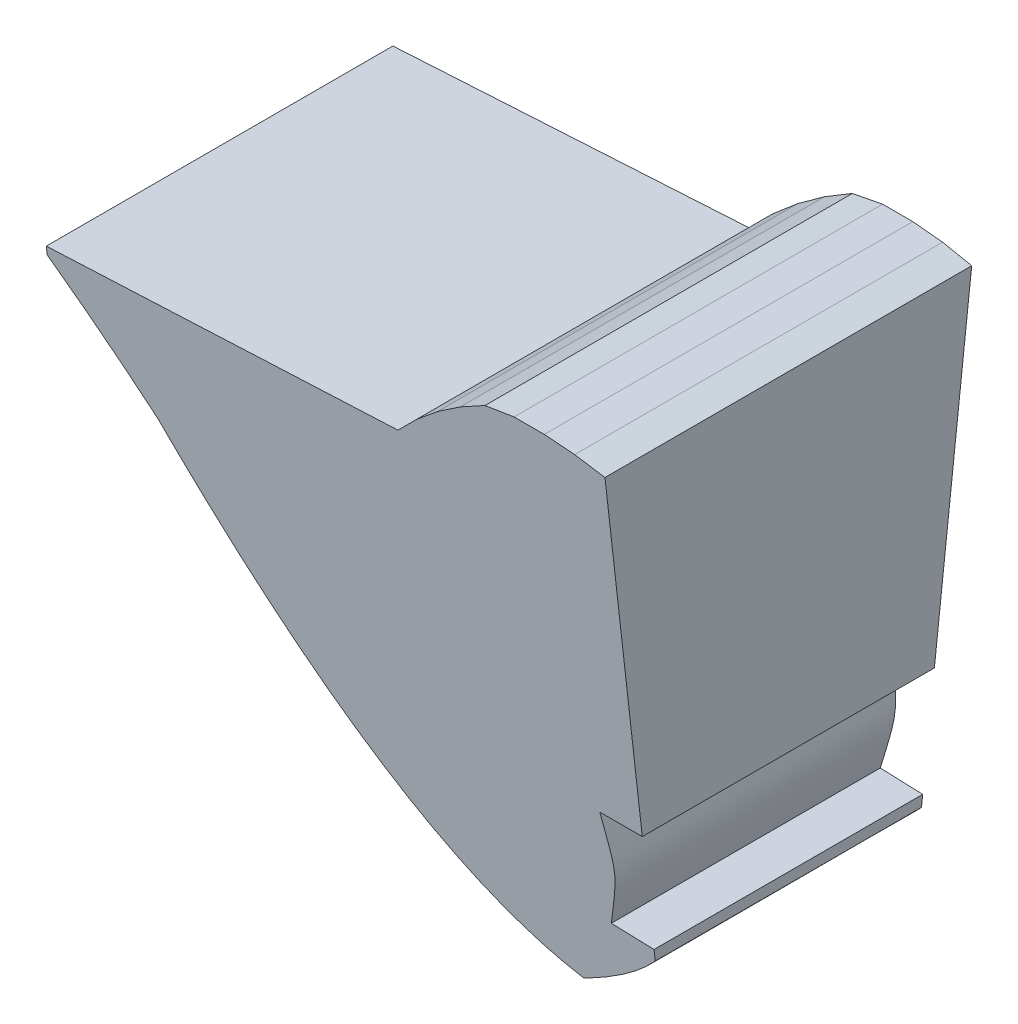
ISO-10303-21;
HEADER;
FILE_DESCRIPTION(('STEP AP214'),'2;1');
FILE_NAME('part.step','',(''),(''),'','','');
FILE_SCHEMA(('AUTOMOTIVE_DESIGN { 1 0 10303 214 1 1 1 1 }'));
ENDSEC;
DATA;
#1=APPLICATION_CONTEXT('core data for automotive mechanical design processes');
#2=APPLICATION_PROTOCOL_DEFINITION('international standard','automotive_design',2000,#1);
#3=PRODUCT_CONTEXT('',#1,'mechanical');
#4=PRODUCT('Part','Part','',(#3));
#5=PRODUCT_RELATED_PRODUCT_CATEGORY('part','',(#4));
#6=PRODUCT_DEFINITION_FORMATION('','',#4);
#7=PRODUCT_DEFINITION_CONTEXT('part definition',#1,'design');
#8=PRODUCT_DEFINITION('design','',#6,#7);
#9=PRODUCT_DEFINITION_SHAPE('','',#8);
#10=(LENGTH_UNIT() NAMED_UNIT(*) SI_UNIT(.MILLI.,.METRE.));
#11=(NAMED_UNIT(*) PLANE_ANGLE_UNIT() SI_UNIT($,.RADIAN.));
#12=(NAMED_UNIT(*) SI_UNIT($,.STERADIAN.) SOLID_ANGLE_UNIT());
#13=UNCERTAINTY_MEASURE_WITH_UNIT(LENGTH_MEASURE(1.E-05),#10,'distance_accuracy_value','');
#14=(GEOMETRIC_REPRESENTATION_CONTEXT(3) GLOBAL_UNCERTAINTY_ASSIGNED_CONTEXT((#13)) GLOBAL_UNIT_ASSIGNED_CONTEXT((#10,
#11,#12)) REPRESENTATION_CONTEXT('',''));
#15=CARTESIAN_POINT('',(0.,0.,0.));
#16=DIRECTION('',(0.,0.,1.));
#17=DIRECTION('',(1.,0.,0.));
#18=AXIS2_PLACEMENT_3D('',#15,#16,#17);
#19=CARTESIAN_POINT('',(0.355125000055651,-1.23774703808888E-13,7.21));
#20=DIRECTION('',(-1.,3.48538412642003E-13,0.));
#21=DIRECTION('',(-3.48538412642003E-13,-1.,0.));
#22=AXIS2_PLACEMENT_3D('',#19,#20,#21);
#23=PLANE('',#22);
#24=DIRECTION('',(0.,-0.993653373689782,0.112485434412263));
#25=VECTOR('',#24,1.);
#26=CARTESIAN_POINT('',(0.355125000056697,12.6081551722012,-7.21));
#27=LINE('',#26,#25);
#28=CARTESIAN_POINT('',(0.355125000056697,15.5338014071494,-7.54119455575611));
#29=VERTEX_POINT('',#28);
#30=CARTESIAN_POINT('',(0.355125000056447,1.97626956518499,-6.00642911422341));
#31=VERTEX_POINT('',#30);
#32=EDGE_CURVE('E58',#29,#31,#27,.T.);
#33=ORIENTED_EDGE('',*,*,#32,.F.);
#34=DIRECTION('',(0.,0.,-1.));
#35=VECTOR('',#34,1.);
#36=CARTESIAN_POINT('',(0.355125000056697,15.5338014071494,23.2398174057259));
#37=LINE('',#36,#35);
#38=CARTESIAN_POINT('',(0.355125000056697,15.5338014071494,7.54119455575611));
#39=VERTEX_POINT('',#38);
#40=EDGE_CURVE('E192',#39,#29,#37,.T.);
#41=ORIENTED_EDGE('',*,*,#40,.F.);
#42=DIRECTION('',(0.,0.993653373689782,0.112485434412263));
#43=VECTOR('',#42,1.);
#44=CARTESIAN_POINT('',(0.355125000056697,12.6081551722012,7.21));
#45=LINE('',#44,#43);
#46=CARTESIAN_POINT('',(0.355125000056697,1.97626956518499,6.00642911422342));
#47=VERTEX_POINT('',#46);
#48=EDGE_CURVE('E244',#47,#39,#45,.T.);
#49=ORIENTED_EDGE('',*,*,#48,.F.);
#50=DIRECTION('',(0.,0.,-1.));
#51=VECTOR('',#50,1.);
#52=CARTESIAN_POINT('',(0.355125000056447,1.97626956518499,7.21));
#53=LINE('',#52,#51);
#54=EDGE_CURVE('E316',#47,#31,#53,.T.);
#55=ORIENTED_EDGE('',*,*,#54,.T.);
#56=EDGE_LOOP('',(#33,#41,#49,#55));
#57=FACE_BOUND('',#56,.T.);
#58=ADVANCED_FACE('F43',(#57),#23,.F.);
#59=CARTESIAN_POINT('',(-23.0359211456035,0.,7.21));
#60=DIRECTION('',(-1.,0.,0.));
#61=DIRECTION('',(0.,0.,1.));
#62=AXIS2_PLACEMENT_3D('',#59,#60,#61);
#63=PLANE('',#62);
#64=DIRECTION('',(0.,0.,-1.));
#65=VECTOR('',#64,1.);
#66=CARTESIAN_POINT('',(-23.0359211456035,11.8716122879342,7.21));
#67=LINE('',#66,#65);
#68=CARTESIAN_POINT('',(-23.0359211456035,11.8716122879342,7.12662047501294));
#69=VERTEX_POINT('',#68);
#70=CARTESIAN_POINT('',(-23.0359211456035,11.8716122879342,-7.12662047501294));
#71=VERTEX_POINT('',#70);
#72=EDGE_CURVE('E325',#69,#71,#67,.T.);
#73=ORIENTED_EDGE('',*,*,#72,.T.);
#74=DIRECTION('',(0.,-0.993653373689782,0.112485434412263));
#75=VECTOR('',#74,1.);
#76=CARTESIAN_POINT('',(-23.0359211456035,12.6081551722012,-7.21));
#77=LINE('',#76,#75);
#78=CARTESIAN_POINT('',(-23.0359211456035,11.5401378200982,-7.08909627341673));
#79=VERTEX_POINT('',#78);
#80=EDGE_CURVE('E239',#71,#79,#77,.T.);
#81=ORIENTED_EDGE('',*,*,#80,.T.);
#82=DIRECTION('',(0.,0.,-1.));
#83=VECTOR('',#82,1.);
#84=CARTESIAN_POINT('',(-23.0359211456035,11.5401378200983,7.21));
#85=LINE('',#84,#83);
#86=CARTESIAN_POINT('',(-23.0359211456035,11.5401378200982,7.08909627341673));
#87=VERTEX_POINT('',#86);
#88=EDGE_CURVE('E319',#87,#79,#85,.T.);
#89=ORIENTED_EDGE('',*,*,#88,.F.);
#90=DIRECTION('',(0.,0.993653373689782,0.112485434412263));
#91=VECTOR('',#90,1.);
#92=CARTESIAN_POINT('',(-23.0359211456035,12.6081551722012,7.21));
#93=LINE('',#92,#91);
#94=EDGE_CURVE('E221',#87,#69,#93,.T.);
#95=ORIENTED_EDGE('',*,*,#94,.T.);
#96=EDGE_LOOP('',(#73,#81,#89,#95));
#97=FACE_BOUND('',#96,.T.);
#98=ADVANCED_FACE('F410',(#97),#63,.T.);
#99=CARTESIAN_POINT('',(-18.9451921135982,7.54091889574655,7.21));
#100=CARTESIAN_POINT('',(-10.2150083842792,-3.69764410322756,7.21));
#101=CARTESIAN_POINT('',(-2.84660482498738,-5.05908110388432,7.21));
#102=(BOUNDED_CURVE() B_SPLINE_CURVE(2,(#99,#100,#101),.UNSPECIFIED.,.F.,
.F.) B_SPLINE_CURVE_WITH_KNOTS((3,3),(0.497667241108509,0.499554279588011),
.UNSPECIFIED.) CURVE() GEOMETRIC_REPRESENTATION_ITEM() RATIONAL_B_SPLINE_CURVE((1.,1.,1.)) REPRESENTATION_ITEM(''));
#103=DIRECTION('',(0.,0.,-1.));
#104=VECTOR('',#103,1.);
#105=SURFACE_OF_LINEAR_EXTRUSION('',#102,#104);
#106=DIRECTION('',(0.,0.,-1.));
#107=VECTOR('',#106,1.);
#108=CARTESIAN_POINT('',(-18.9451921135982,7.54091889574657,7.21));
#109=LINE('',#108,#107);
#110=CARTESIAN_POINT('',(-18.9451921135982,7.54091889574657,6.63636910524442));
#111=VERTEX_POINT('',#110);
#112=CARTESIAN_POINT('',(-18.9451921135982,7.54091889574657,-6.63636910524442));
#113=VERTEX_POINT('',#112);
#114=EDGE_CURVE('E315',#111,#113,#109,.T.);
#115=ORIENTED_EDGE('',*,*,#114,.T.);
#116=CARTESIAN_POINT('',(-18.9451921135982,7.54091889574655,-6.63636910524441));
#117=CARTESIAN_POINT('',(-18.7033608655423,7.22962108931645,-6.60112898035273));
#118=CARTESIAN_POINT('',(-18.4592647140916,6.9200497206851,-6.56608429494821));
#119=CARTESIAN_POINT('',(-17.9661198805234,6.30464603742845,-6.49641819962467));
#120=CARTESIAN_POINT('',(-17.7170694462669,5.99881510969872,-6.46179694670763));
#121=CARTESIAN_POINT('',(-17.2137366178937,5.3913665824337,-6.39303140604553));
#122=CARTESIAN_POINT('',(-16.9594535947769,5.08974949683998,-6.35888717648066));
#123=CARTESIAN_POINT('',(-16.4451285665965,4.49103725761873,-6.29111061767257));
#124=CARTESIAN_POINT('',(-16.1850826962375,4.19394537928884,-6.25747865920581));
#125=CARTESIAN_POINT('',(-15.6590118901181,3.60508061675355,-6.1908168731366));
#126=CARTESIAN_POINT('',(-15.3929875534481,3.31330720485499,-6.15778698579723));
#127=CARTESIAN_POINT('',(-14.8544901847056,2.7357195544677,-6.09240181277284));
#128=CARTESIAN_POINT('',(-14.5820174931064,2.44990500284308,-6.06004649163962));
#129=CARTESIAN_POINT('',(-13.9777704357619,1.83142011947111,-5.99003159245484));
#130=CARTESIAN_POINT('',(-13.6445482479649,1.50014167377654,-5.95252958132897));
#131=CARTESIAN_POINT('',(-12.9673134934436,0.848664446736888,-5.87877982026175));
#132=CARTESIAN_POINT('',(-12.623301443116,0.528465136688492,-5.84253201046914));
#133=CARTESIAN_POINT('',(-11.9227759490938,-0.0995013958587514,-5.7714437516454));
#134=CARTESIAN_POINT('',(-11.5662405708663,-0.407244542107335,-5.73660602813964));
#135=CARTESIAN_POINT('',(-10.840142749037,-1.00720368374379,-5.66868831511867));
#136=CARTESIAN_POINT('',(-10.4705807273197,-1.29942018121482,-5.6356082687657));
#137=CARTESIAN_POINT('',(-9.71382699072171,-1.86779135556405,-5.57126643674768));
#138=CARTESIAN_POINT('',(-9.32650636654571,-2.14377746328672,-5.540023733768));
#139=CARTESIAN_POINT('',(-8.5360986768139,-2.67282289543975,-5.48013372902864));
#140=CARTESIAN_POINT('',(-8.13300835344273,-2.92587744631612,-5.45148696765387));
#141=CARTESIAN_POINT('',(-7.31201826568453,-3.40280761684766,-5.39749661363601));
#142=CARTESIAN_POINT('',(-6.89419365451789,-3.62680992502778,-5.37213867935817));
#143=CARTESIAN_POINT('',(-6.04187322097519,-4.0405536088069,-5.32530128189388));
#144=CARTESIAN_POINT('',(-5.60738935372736,-4.23031901573022,-5.30381909826786));
#145=CARTESIAN_POINT('',(-4.78985442909107,-4.54236533838515,-5.26849423842238));
#146=CARTESIAN_POINT('',(-4.4091055725695,-4.67052923075731,-5.25398558631979));
#147=CARTESIAN_POINT('',(-3.82960691198316,-4.83674345690554,-5.23516948814227));
#148=CARTESIAN_POINT('',(-3.63462104960687,-4.8878904691115,-5.22937944702812));
#149=CARTESIAN_POINT('',(-3.24229120544362,-4.9807402777546,-5.21886848683127));
#150=CARTESIAN_POINT('',(-3.0449461414238,-5.02243854990591,-5.21414807991536));
#151=CARTESIAN_POINT('',(-2.84660482498738,-5.05908110388432,-5.21));
#152=B_SPLINE_CURVE_WITH_KNOTS('',3,(#116,#117,#118,#119,#120,#121,#122,#123,#124,#125,#126,
#127,#128,#129,#130,#131,#132,#133,#134,#135,#136,#137,#138,#139,#140,#141,#142,#143,#144,#145,
#146,#147,#148,#149,#150,#151),.UNSPECIFIED.,.F.,.F.,(4,2,2,2,2,2,2,2,2,2,2,2,2,2,2,2,2,4),(0.,
1.1872997216569,2.37502708567824,3.56289806807204,4.75159146291787,5.9401662676152,
7.12867845491363,8.54255640265696,9.95636678593971,11.3727907462706,12.7891688759803,
14.2183172044781,15.6477623519031,17.0707480146133,18.4927309460623,19.6971402338765,
20.3019233237111,20.9069953892921),.UNSPECIFIED.);
#153=CARTESIAN_POINT('',(-2.84660482498738,-5.05908110388432,-5.21));
#154=VERTEX_POINT('',#153);
#155=EDGE_CURVE('E356',#113,#154,#152,.T.);
#156=ORIENTED_EDGE('',*,*,#155,.T.);
#157=DIRECTION('',(0.,0.,-1.));
#158=VECTOR('',#157,1.);
#159=CARTESIAN_POINT('',(-2.84660482498738,-5.05908110388432,7.21));
#160=LINE('',#159,#158);
#161=CARTESIAN_POINT('',(-2.84660482498738,-5.05908110388432,5.21));
#162=VERTEX_POINT('',#161);
#163=EDGE_CURVE('E340',#162,#154,#160,.T.);
#164=ORIENTED_EDGE('',*,*,#163,.F.);
#165=CARTESIAN_POINT('',(-2.84660482498738,-5.05908110388432,5.21));
#166=CARTESIAN_POINT('',(-3.0836355452615,-5.01529762547054,5.21495646039138));
#167=CARTESIAN_POINT('',(-3.31925014057108,-4.96428184629726,5.22073164541478));
#168=CARTESIAN_POINT('',(-3.78628189704186,-4.84911384389608,5.23376911212451));
#169=CARTESIAN_POINT('',(-4.01771143135529,-4.78501130060695,5.24102576984815));
#170=CARTESIAN_POINT('',(-4.47638324853452,-4.64477679089168,5.25690086287615));
#171=CARTESIAN_POINT('',(-4.70363211310206,-4.56866593727755,5.26551690812791));
#172=CARTESIAN_POINT('',(-5.1539801611568,-4.40545252874729,5.28399330205617));
#173=CARTESIAN_POINT('',(-5.37708095327682,-4.31835434125152,5.29385315632366));
#174=CARTESIAN_POINT('',(-5.81545834234536,-4.13567110279715,5.31453361087802));
#175=CARTESIAN_POINT('',(-6.03080317783365,-4.04024711994086,5.32533597762798));
#176=CARTESIAN_POINT('',(-6.45748946905634,-3.84057736608456,5.34793937192645));
#177=CARTESIAN_POINT('',(-6.66882789943329,-3.73632522989765,5.35974112003892));
#178=CARTESIAN_POINT('',(-7.08747417766979,-3.51983158147829,5.38424904476877));
#179=CARTESIAN_POINT('',(-7.29477947597257,-3.40758521204135,5.39695577124062));
#180=CARTESIAN_POINT('',(-7.70530843131035,-3.17590609220346,5.42318275051655));
#181=CARTESIAN_POINT('',(-7.90853147430462,-3.0564722713248,5.43670312450288));
#182=CARTESIAN_POINT('',(-8.45410340689061,-2.72385368196738,5.47435684511425));
#183=CARTESIAN_POINT('',(-8.79259906035209,-2.50440768840731,5.49919898682003));
#184=CARTESIAN_POINT('',(-9.45845448583479,-2.04949644973372,5.5506967119384));
#185=CARTESIAN_POINT('',(-9.78581359629267,-1.81403025542841,5.5773524028032));
#186=CARTESIAN_POINT('',(-10.4302582396863,-1.32938575303013,5.63221604925302));
#187=CARTESIAN_POINT('',(-10.7473396395034,-1.08020203459831,5.66042461730948));
#188=CARTESIAN_POINT('',(-11.3718438106499,-0.570176876647104,5.71816145288252));
#189=CARTESIAN_POINT('',(-11.6792662750814,-0.309335067346119,5.74768976225981));
#190=CARTESIAN_POINT('',(-12.2887351366992,0.225514030316342,5.80823676455314));
#191=CARTESIAN_POINT('',(-12.5906756597182,0.499640146613562,5.83926890925461));
#192=CARTESIAN_POINT('',(-13.1859914625247,1.05668157973797,5.90232817041119));
#193=CARTESIAN_POINT('',(-13.4793699933214,1.33959347409339,5.93435489942917));
#194=CARTESIAN_POINT('',(-14.0582984741035,1.91313890151101,5.99928247705986));
#195=CARTESIAN_POINT('',(-14.3438493181123,2.20377154523463,6.03218322499598));
#196=CARTESIAN_POINT('',(-14.9077244427009,2.7918210558895,6.09875272137508));
#197=CARTESIAN_POINT('',(-15.1860493084316,3.08923736980037,6.13242140721399));
#198=CARTESIAN_POINT('',(-15.7683607406539,3.72540309630891,6.20443784674841));
#199=CARTESIAN_POINT('',(-16.0715178451228,4.06490144250158,6.24287038264565));
#200=CARTESIAN_POINT('',(-16.6701836985208,4.7504922746204,6.32048193675692));
#201=CARTESIAN_POINT('',(-16.9656923307507,5.09658486102068,6.35966096634501));
#202=CARTESIAN_POINT('',(-17.4495199616275,5.67490501691598,6.42512906184765));
#203=CARTESIAN_POINT('',(-17.6398456690967,5.90547984199544,6.45123103065322));
#204=CARTESIAN_POINT('',(-18.0176052393411,6.36895711711416,6.50369846448112));
#205=CARTESIAN_POINT('',(-18.205039097963,6.60185957049552,6.5300639298818));
#206=CARTESIAN_POINT('',(-18.5771476687389,7.06981539005112,6.58303835239394));
#207=CARTESIAN_POINT('',(-18.7618224957771,7.30486866600559,6.60964729929217));
#208=CARTESIAN_POINT('',(-18.9451921135982,7.54091889574655,6.63636910524441));
#209=B_SPLINE_CURVE_WITH_KNOTS('',3,(#165,#166,#167,#168,#169,#170,#171,#172,#173,#174,#175,
#176,#177,#178,#179,#180,#181,#182,#183,#184,#185,#186,#187,#188,#189,#190,#191,#192,#193,#194,
#195,#196,#197,#198,#199,#200,#201,#202,#203,#204,#205,#206,#207,#208),.UNSPECIFIED.,.F.,.F.,(4,
2,2,2,2,2,2,2,2,2,2,2,2,2,2,2,2,2,2,2,2,4),(0.,0.723070627629283,1.44344574109941,
2.16256813451498,2.88140557514503,3.58855192345824,4.2962125448096,5.0043068623572,
5.71250690363926,6.92441762508089,8.13640021448464,9.3488642962315,10.5613668633146,
11.788141520998,13.0144441434254,14.2406061176645,15.4666684871313,16.8368576095009,
18.2070676256843,19.1073954524656,20.0077245721621,20.9080160976373),.UNSPECIFIED.);
#210=EDGE_CURVE('E274',#162,#111,#209,.T.);
#211=ORIENTED_EDGE('',*,*,#210,.T.);
#212=EDGE_LOOP('',(#115,#156,#164,#211));
#213=FACE_BOUND('',#212,.T.);
#214=ADVANCED_FACE('F44',(#213),#105,.F.);
#215=CARTESIAN_POINT('',(-2.84660482498738,-5.05908110388432,7.21));
#216=CARTESIAN_POINT('',(-0.742366881974002,-3.93520659958673,7.21));
#217=CARTESIAN_POINT('',(0.355124999965198,-2.72325322699678,7.21));
#218=(BOUNDED_CURVE() B_SPLINE_CURVE(2,(#215,#216,#217),.UNSPECIFIED.,.F.,
.F.) B_SPLINE_CURVE_WITH_KNOTS((3,3),(0.498812074629495,0.499412845463797),
.UNSPECIFIED.) CURVE() GEOMETRIC_REPRESENTATION_ITEM() RATIONAL_B_SPLINE_CURVE((1.,1.,1.)) REPRESENTATION_ITEM(''));
#219=DIRECTION('',(0.,0.,-1.));
#220=VECTOR('',#219,1.);
#221=SURFACE_OF_LINEAR_EXTRUSION('',#218,#220);
#222=ORIENTED_EDGE('',*,*,#163,.T.);
#223=CARTESIAN_POINT('',(-2.84660482498738,-5.05908110388432,-5.21));
#224=CARTESIAN_POINT('',(-2.67154367534484,-4.96554243060771,-5.22058894235803));
#225=CARTESIAN_POINT('',(-2.49778385523126,-4.86952307483158,-5.23145870764283));
#226=CARTESIAN_POINT('',(-2.15332890723938,-4.67164155861341,-5.25385966647147));
#227=CARTESIAN_POINT('',(-1.9826387176766,-4.56977092703724,-5.26539181898071));
#228=CARTESIAN_POINT('',(-1.64527137465746,-4.35955519460265,-5.2891890591545));
#229=CARTESIAN_POINT('',(-1.47859514121983,-4.25120862887406,-5.30145431264808));
#230=CARTESIAN_POINT('',(-1.15044448784201,-4.02724001195876,-5.32680843294344));
#231=CARTESIAN_POINT('',(-0.98896568487432,-3.911624347545,-5.33989657673763));
#232=CARTESIAN_POINT('',(-0.724614348138144,-3.7114805449727,-5.36255363519824));
#233=CARTESIAN_POINT('',(-0.619967455079453,-3.6292658395869,-5.37186066025876));
#234=CARTESIAN_POINT('',(-0.414118763296717,-3.46070156785231,-5.39094279275538));
#235=CARTESIAN_POINT('',(-0.312916415666604,-3.3743526656372,-5.40071782500895));
#236=CARTESIAN_POINT('',(-0.114288127047668,-3.19685300163986,-5.42081147873311));
#237=CARTESIAN_POINT('',(-0.0168745915935634,-3.10568844995875,-5.431131661274));
#238=CARTESIAN_POINT('',(0.173044677325633,-2.91833195578561,-5.45234114658855));
#239=CARTESIAN_POINT('',(0.265547074526193,-2.82213668167119,-5.46323082651485));
#240=CARTESIAN_POINT('',(0.355124999965198,-2.72325322699678,-5.47442481895704));
#241=B_SPLINE_CURVE_WITH_KNOTS('',3,(#223,#224,#225,#226,#227,#228,#229,#230,#231,#232,#233,
#234,#235,#236,#237,#238,#239,#240),.UNSPECIFIED.,.F.,.F.,(4,2,2,2,2,2,2,2,4),(0.,
0.596333361221147,1.19355295493407,1.79090815604603,2.38774565156578,2.78786762990545,
3.18792554534165,3.58919872466333,3.99074110013676),.UNSPECIFIED.);
#242=CARTESIAN_POINT('',(0.355125000010947,-2.72325322699678,-5.47442481895703));
#243=VERTEX_POINT('',#242);
#244=EDGE_CURVE('E362',#154,#243,#241,.T.);
#245=ORIENTED_EDGE('',*,*,#244,.T.);
#246=DIRECTION('',(0.,0.,-1.));
#247=VECTOR('',#246,1.);
#248=CARTESIAN_POINT('',(0.355124999965198,-2.72325322699678,7.21));
#249=LINE('',#248,#247);
#250=CARTESIAN_POINT('',(0.355125000010947,-2.72325322699678,5.47442481895703));
#251=VERTEX_POINT('',#250);
#252=EDGE_CURVE('E331',#251,#243,#249,.T.);
#253=ORIENTED_EDGE('',*,*,#252,.F.);
#254=CARTESIAN_POINT('',(0.355124999965198,-2.72325322699678,5.47442481895703));
#255=CARTESIAN_POINT('',(0.288265800066398,-2.79707578870119,5.46606781726749));
#256=CARTESIAN_POINT('',(0.219762299322532,-2.86939557158838,5.45788093599675));
#257=CARTESIAN_POINT('',(0.0798741499126208,-3.0111837154317,5.44182996553056));
#258=CARTESIAN_POINT('',(0.00849051694650479,-3.08065306448068,5.43396576447915));
#259=CARTESIAN_POINT('',(-0.209110404202349,-3.28478130911614,5.41085765164865));
#260=CARTESIAN_POINT('',(-0.359086186155244,-3.41549544786354,5.39606030171743));
#261=CARTESIAN_POINT('',(-0.666431647279958,-3.66745151891472,5.36753789253992));
#262=CARTESIAN_POINT('',(-0.823790135326829,-3.78870709059741,5.35381128926277));
#263=CARTESIAN_POINT('',(-1.14463764434189,-4.02329424679429,5.32725510893767));
#264=CARTESIAN_POINT('',(-1.30813354467851,-4.13661650521983,5.31442658763929));
#265=CARTESIAN_POINT('',(-1.58497175174893,-4.31986712055689,5.29368190381061));
#266=CARTESIAN_POINT('',(-1.69701528140079,-4.39175032218513,5.28554444523986));
#267=CARTESIAN_POINT('',(-1.92294333828473,-4.53261962763427,5.26959749086083));
#268=CARTESIAN_POINT('',(-2.03682799400811,-4.6016055280346,5.26178801808056));
#269=CARTESIAN_POINT('',(-2.26591352019373,-4.73675126913538,5.24648899349189));
#270=CARTESIAN_POINT('',(-2.38111062922232,-4.80291742324192,5.23899872698133));
#271=CARTESIAN_POINT('',(-2.6128736149529,-4.93278949726635,5.22429670205848));
#272=CARTESIAN_POINT('',(-2.72943923096306,-4.99649587614853,5.21708489168965));
#273=CARTESIAN_POINT('',(-2.84660482498738,-5.05908110388432,5.21));
#274=B_SPLINE_CURVE_WITH_KNOTS('',3,(#254,#255,#256,#257,#258,#259,#260,#261,#262,#263,#264,
#265,#266,#267,#268,#269,#270,#271,#272,#273),.UNSPECIFIED.,.F.,.F.,(4,2,2,2,2,2,2,2,2,4),(0.,
0.299782926841572,0.599461041577767,1.1974499434567,1.79455995327913,2.39236050766276,
2.79242459253001,3.19251671924541,3.59166012626068,3.99072869445439),.UNSPECIFIED.);
#275=EDGE_CURVE('E279',#251,#162,#274,.T.);
#276=ORIENTED_EDGE('',*,*,#275,.T.);
#277=EDGE_LOOP('',(#222,#245,#253,#276));
#278=FACE_BOUND('',#277,.T.);
#279=ADVANCED_FACE('F287',(#278),#221,.F.);
#280=CARTESIAN_POINT('',(0.355125000532009,-7.39148800447813E-11,7.21));
#281=DIRECTION('',(1.,-2.08137641489758E-10,0.));
#282=DIRECTION('',(2.08137641489758E-10,1.,0.));
#283=AXIS2_PLACEMENT_3D('',#280,#281,#282);
#284=PLANE('',#283);
#285=CARTESIAN_POINT('',(0.355125000056697,-2.28484178142546,-5.52405470319249));
#286=VERTEX_POINT('',#285);
#287=EDGE_CURVE('E240',#286,#243,#27,.T.);
#288=ORIENTED_EDGE('',*,*,#287,.F.);
#289=DIRECTION('',(0.,0.,-1.));
#290=VECTOR('',#289,1.);
#291=CARTESIAN_POINT('',(0.355125000056447,-2.28484178142545,7.21));
#292=LINE('',#291,#290);
#293=CARTESIAN_POINT('',(0.355125000056697,-2.28484178142546,5.52405470319249));
#294=VERTEX_POINT('',#293);
#295=EDGE_CURVE('E332',#294,#286,#292,.T.);
#296=ORIENTED_EDGE('',*,*,#295,.F.);
#297=EDGE_CURVE('E237',#251,#294,#45,.T.);
#298=ORIENTED_EDGE('',*,*,#297,.F.);
#299=ORIENTED_EDGE('',*,*,#252,.T.);
#300=EDGE_LOOP('',(#288,#296,#298,#299));
#301=FACE_BOUND('',#300,.T.);
#302=ADVANCED_FACE('F294',(#301),#284,.T.);
#303=CARTESIAN_POINT('',(-0.0792587195419091,-2.26967276768239,7.21));
#304=DIRECTION('',(-0.0348994967024901,-0.999390827019096,0.));
#305=DIRECTION('',(0.999390827019096,-0.0348994967024901,0.));
#306=AXIS2_PLACEMENT_3D('',#303,#304,#305);
#307=PLANE('',#306);
#308=ORIENTED_EDGE('',*,*,#295,.T.);
#309=DIRECTION('',(-0.999383027616045,0.034899224341334,-0.00395072820626436));
#310=VECTOR('',#309,1.);
#311=CARTESIAN_POINT('',(-0.0289741896082848,-2.2714287421612,-5.52557311151111));
#312=LINE('',#311,#310);
#313=CARTESIAN_POINT('',(-1.39487499994356,-2.22373043481491,-5.5309727457947));
#314=VERTEX_POINT('',#313);
#315=EDGE_CURVE('E346',#286,#314,#312,.T.);
#316=ORIENTED_EDGE('',*,*,#315,.T.);
#317=DIRECTION('',(0.,0.,-1.));
#318=VECTOR('',#317,1.);
#319=CARTESIAN_POINT('',(-1.39487499994356,-2.22373043481491,7.21));
#320=LINE('',#319,#318);
#321=CARTESIAN_POINT('',(-1.39487499994356,-2.22373043481491,5.5309727457947));
#322=VERTEX_POINT('',#321);
#323=EDGE_CURVE('E329',#322,#314,#320,.T.);
#324=ORIENTED_EDGE('',*,*,#323,.F.);
#325=DIRECTION('',(0.999383027616045,-0.034899224341334,-0.00395072820626436));
#326=VECTOR('',#325,1.);
#327=CARTESIAN_POINT('',(-0.0859085417339361,-2.26944055077446,5.52579818252456));
#328=LINE('',#327,#326);
#329=EDGE_CURVE('E251',#322,#294,#328,.T.);
#330=ORIENTED_EDGE('',*,*,#329,.T.);
#331=EDGE_LOOP('',(#308,#316,#324,#330));
#332=FACE_BOUND('',#331,.T.);
#333=ADVANCED_FACE('F420',(#332),#307,.F.);
#334=CARTESIAN_POINT('',(-1.39487499994356,-2.22373043481491,7.21));
#335=CARTESIAN_POINT('',(-0.907530669798052,-0.123730434814926,7.21));
#336=CARTESIAN_POINT('',(-1.39487499994356,1.976269565185,7.21));
#337=(BOUNDED_CURVE() B_SPLINE_CURVE(2,(#334,#335,#336),.UNSPECIFIED.,.F.,
.F.) B_SPLINE_CURVE_WITH_KNOTS((3,3),(0.,1.),
.UNSPECIFIED.) CURVE() GEOMETRIC_REPRESENTATION_ITEM() RATIONAL_B_SPLINE_CURVE((1.,
3.23180121851367,1.)) REPRESENTATION_ITEM(''));
#338=DIRECTION('',(0.,0.,-1.));
#339=VECTOR('',#338,1.);
#340=SURFACE_OF_LINEAR_EXTRUSION('',#337,#339);
#341=ORIENTED_EDGE('',*,*,#323,.T.);
#342=CARTESIAN_POINT('',(-1.39487499994356,-2.22373043481491,-5.5309727457947));
#343=CARTESIAN_POINT('',(-1.38202447122813,-2.16835021356968,-5.53724200266994));
#344=CARTESIAN_POINT('',(-1.36921744547373,-2.11295996104296,-5.54351239512535));
#345=CARTESIAN_POINT('',(-1.34371955909939,-2.00215267308472,-5.55605621196536));
#346=CARTESIAN_POINT('',(-1.33102869927897,-1.94673563747162,-5.56232963637053));
#347=CARTESIAN_POINT('',(-1.30579250980865,-1.83586894873068,-5.57488017761064));
#348=CARTESIAN_POINT('',(-1.29324717983284,-1.78041929567618,-5.58115729443729));
#349=CARTESIAN_POINT('',(-1.26834035470031,-1.66945670178657,-5.593718692514));
#350=CARTESIAN_POINT('',(-1.25597893242913,-1.61394374477822,-5.60000297559494));
#351=CARTESIAN_POINT('',(-1.23150428056634,-1.50286329328951,-5.61257771561119));
#352=CARTESIAN_POINT('',(-1.21939105277074,-1.44729579841754,-5.61886817259083));
#353=CARTESIAN_POINT('',(-1.19550012207595,-1.33608743052918,-5.63145739324204));
#354=CARTESIAN_POINT('',(-1.1837224309966,-1.2804465549999,-5.63775615719808));
#355=CARTESIAN_POINT('',(-1.15485704104805,-1.14125615214793,-5.65351305326002));
#356=CARTESIAN_POINT('',(-1.13805530724695,-1.05764770999797,-5.66297785475397));
#357=CARTESIAN_POINT('',(-1.10616760722362,-0.890046794372652,-5.68195093158457));
#358=CARTESIAN_POINT('',(-1.09108267359643,-0.806054121054038,-5.69145922954426));
#359=CARTESIAN_POINT('',(-1.06839764881353,-0.664871544058104,-5.70744164748328));
#360=CARTESIAN_POINT('',(-1.05995626751594,-0.607817685780514,-5.71390036659317));
#361=CARTESIAN_POINT('',(-1.04516806244473,-0.493450404650502,-5.72684718853439));
#362=CARTESIAN_POINT('',(-1.03882061818002,-0.436137063802354,-5.73333528208253));
#363=CARTESIAN_POINT('',(-1.02903068414648,-0.32130807468907,-5.74633437116685));
#364=CARTESIAN_POINT('',(-1.02558541499307,-0.263792673078832,-5.75284533878074));
#365=CARTESIAN_POINT('',(-1.02222407231355,-0.148714957691158,-5.76587258464866));
#366=CARTESIAN_POINT('',(-1.02230420900467,-0.0911527608046728,-5.77238884967019));
#367=CARTESIAN_POINT('',(-1.02596900528622,0.0239015023985969,-5.78541344065945));
#368=CARTESIAN_POINT('',(-1.02955657044098,0.0813934710005598,-5.79192175556548));
#369=CARTESIAN_POINT('',(-1.03959132289802,0.19613338530381,-5.80491076103415));
#370=CARTESIAN_POINT('',(-1.04603929917214,0.253381259276289,-5.81139144347682));
#371=CARTESIAN_POINT('',(-1.05997220439613,0.35983137212623,-5.8234420111136));
#372=CARTESIAN_POINT('',(-1.06719667195452,0.409068491171902,-5.82901584487869));
#373=CARTESIAN_POINT('',(-1.08274764683563,0.507347946837772,-5.84014146227917));
#374=CARTESIAN_POINT('',(-1.0910737056158,0.556390354412903,-5.84569325394695));
#375=CARTESIAN_POINT('',(-1.10853037258208,0.654424381213792,-5.85679108784343));
#376=CARTESIAN_POINT('',(-1.11766242226862,0.70341574413319,-5.86233710105724));
#377=CARTESIAN_POINT('',(-1.1364977866421,0.801294033672846,-5.8734173048888));
#378=CARTESIAN_POINT('',(-1.14620115522269,0.850180949988233,-5.87895149433999));
#379=CARTESIAN_POINT('',(-1.16833495400599,0.959258362431623,-5.89129948252998));
#380=CARTESIAN_POINT('',(-1.1808737668477,1.01942705832357,-5.89811081339709));
#381=CARTESIAN_POINT('',(-1.20639174214038,1.13967062360228,-5.91172285360526));
#382=CARTESIAN_POINT('',(-1.21937089694786,1.19974549459873,-5.91852356312855));
#383=CARTESIAN_POINT('',(-1.24564626429316,1.31982703510014,-5.93211726150049));
#384=CARTESIAN_POINT('',(-1.2589424791072,1.37983370411223,-5.93891025029334));
#385=CARTESIAN_POINT('',(-1.28569888355067,1.49948275843749,-5.95245498954463));
#386=CARTESIAN_POINT('',(-1.29915785770072,1.55912541262012,-5.95920677044014));
#387=CARTESIAN_POINT('',(-1.32625009614692,1.67837055204035,-5.97270578495002));
#388=CARTESIAN_POINT('',(-1.33988335761136,1.73797303791406,-5.97945301863641));
#389=CARTESIAN_POINT('',(-1.36728618039678,1.85714403003134,-5.99294363938264));
#390=CARTESIAN_POINT('',(-1.381055735056,1.91671253778666,-5.9996870266136));
#391=CARTESIAN_POINT('',(-1.39487499994356,1.976269565185,-6.00642911422342));
#392=B_SPLINE_CURVE_WITH_KNOTS('',3,(#342,#343,#344,#345,#346,#347,#348,#349,#350,#351,#352,
#353,#354,#355,#356,#357,#358,#359,#360,#361,#362,#363,#364,#365,#366,#367,#368,#369,#370,#371,
#372,#373,#374,#375,#376,#377,#378,#379,#380,#381,#382,#383,#384,#385,#386,#387,#388,#389,#390,
#391),.UNSPECIFIED.,.F.,.F.,(4,2,2,2,2,2,2,2,2,2,2,2,2,2,2,2,2,2,2,2,2,2,2,2,4),(0.,
0.171588763273453,0.343178706622211,0.514768265617105,0.686424107910212,0.858081191922479,
1.02974431538338,1.28714724145325,1.54470417716685,1.71878537631805,1.8928149439917,
2.06667765516018,2.24035346989174,2.41417328020677,2.58804106414591,2.73825198714263,
2.88840193486919,3.03882608638502,3.18926445051695,3.37477476712053,3.56028186526787,
3.74579029559563,3.93033206952695,4.11487084894101,4.29940065253389),.UNSPECIFIED.);
#393=CARTESIAN_POINT('',(-1.39487499994356,1.976269565185,-6.00642911422342));
#394=VERTEX_POINT('',#393);
#395=EDGE_CURVE('E350',#314,#394,#392,.T.);
#396=ORIENTED_EDGE('',*,*,#395,.T.);
#397=DIRECTION('',(0.,0.,-1.));
#398=VECTOR('',#397,1.);
#399=CARTESIAN_POINT('',(-1.39487499994356,1.976269565185,7.21));
#400=LINE('',#399,#398);
#401=CARTESIAN_POINT('',(-1.39487499994356,1.976269565185,6.00642911422342));
#402=VERTEX_POINT('',#401);
#403=EDGE_CURVE('E324',#402,#394,#400,.T.);
#404=ORIENTED_EDGE('',*,*,#403,.F.);
#405=CARTESIAN_POINT('',(-1.39487499994356,1.976269565185,6.00642911422342));
#406=CARTESIAN_POINT('',(-1.37907511533365,1.90817072448153,5.99872006005792));
#407=CARTESIAN_POINT('',(-1.36333836969219,1.84005724657732,5.99100934890426));
#408=CARTESIAN_POINT('',(-1.33204781411177,1.703774616767,5.97558162408294));
#409=CARTESIAN_POINT('',(-1.31649404111311,1.63560545649229,5.96786460946793));
#410=CARTESIAN_POINT('',(-1.28563112684324,1.49920642241426,5.95242370722985));
#411=CARTESIAN_POINT('',(-1.27032200601989,1.43097654403409,5.94469981908867));
#412=CARTESIAN_POINT('',(-1.2399275173513,1.29390485970128,5.92918277022027));
#413=CARTESIAN_POINT('',(-1.22484485449072,1.22506245970345,5.92138954224482));
#414=CARTESIAN_POINT('',(-1.19518112320204,1.0872751663326,5.90579148364441));
#415=CARTESIAN_POINT('',(-1.18060002365467,1.01833027959621,5.89798665377074));
#416=CARTESIAN_POINT('',(-1.1521828568661,0.880291295746957,5.88236010282727));
#417=CARTESIAN_POINT('',(-1.13834675067045,0.81119720663251,5.87453838266293));
#418=CARTESIAN_POINT('',(-1.11516473949854,0.690174385789182,5.86083812768789));
#419=CARTESIAN_POINT('',(-1.10556404533104,0.638294159941606,5.85496508393199));
#420=CARTESIAN_POINT('',(-1.08728934318226,0.534373551286744,5.8432008660282));
#421=CARTESIAN_POINT('',(-1.07861528667302,0.482333177013413,5.83730969284637));
#422=CARTESIAN_POINT('',(-1.06260440200736,0.378149691610768,5.82551571627023));
#423=CARTESIAN_POINT('',(-1.05526500549272,0.326006977236309,5.81961295779011));
#424=CARTESIAN_POINT('',(-1.04244257361275,0.221494061638693,5.80778168843203));
#425=CARTESIAN_POINT('',(-1.03695934618146,0.169123884520429,5.80185318028283));
#426=CARTESIAN_POINT('',(-1.02917052981484,0.0729301509045451,5.79096367474698));
#427=CARTESIAN_POINT('',(-1.02648754730517,0.029137538921467,5.78600618039996));
#428=CARTESIAN_POINT('',(-1.02311803398459,-0.0585228047861233,5.77608268785843));
#429=CARTESIAN_POINT('',(-1.02243133042271,-0.10239052968188,5.77111669043696));
#430=CARTESIAN_POINT('',(-1.02313587995194,-0.190112899664058,5.76118617627941));
#431=CARTESIAN_POINT('',(-1.02452732528276,-0.233967543165022,5.75622165972282));
#432=CARTESIAN_POINT('',(-1.02922830316647,-0.321575626235211,5.74630408328911));
#433=CARTESIAN_POINT('',(-1.03253802615093,-0.365329055323648,5.74135102459847));
#434=CARTESIAN_POINT('',(-1.04481913269156,-0.496026010219698,5.72655561994619));
#435=CARTESIAN_POINT('',(-1.05614963950478,-0.582745183351363,5.71673867158183));
#436=CARTESIAN_POINT('',(-1.08246686740171,-0.755641929816293,5.69716608606103));
#437=CARTESIAN_POINT('',(-1.09745579058543,-0.84181914476287,5.68741048947536));
#438=CARTESIAN_POINT('',(-1.129420439335,-1.01366509487317,5.66795685819712));
#439=CARTESIAN_POINT('',(-1.14639302616418,-1.09933441387988,5.65825875741124));
#440=CARTESIAN_POINT('',(-1.18149622255001,-1.27039766561497,5.63889373063944));
#441=CARTESIAN_POINT('',(-1.19962634896168,-1.35579169781193,5.62922679339328));
#442=CARTESIAN_POINT('',(-1.24641099322308,-1.57177275123237,5.60477689641502));
#443=CARTESIAN_POINT('',(-1.2755379218154,-1.70225834502177,5.59000541866374));
#444=CARTESIAN_POINT('',(-1.31987060164556,-1.89787014932725,5.56786140006925));
#445=CARTESIAN_POINT('',(-1.33475842772637,-1.96306843680887,5.56048069983263));
#446=CARTESIAN_POINT('',(-1.36470186719661,-2.09342597092531,5.54572371893541));
#447=CARTESIAN_POINT('',(-1.37975747811874,-2.15858521811941,5.53834743821149));
#448=CARTESIAN_POINT('',(-1.39487499994356,-2.22373043481491,5.5309727457947));
#449=B_SPLINE_CURVE_WITH_KNOTS('',3,(#405,#406,#407,#408,#409,#410,#411,#412,#413,#414,#415,
#416,#417,#418,#419,#420,#421,#422,#423,#424,#425,#426,#427,#428,#429,#430,#431,#432,#433,#434,
#435,#436,#437,#438,#439,#440,#441,#442,#443,#444,#445,#446,#447,#448),.UNSPECIFIED.,.F.,.F.,(4,
2,2,2,2,2,2,2,2,2,2,2,2,2,2,2,2,2,2,2,2,4),(0.,0.210994688118994,0.422031267037357,
0.633085392962154,0.845798629208893,1.05849864386888,1.27118752598179,1.4304428147189,
1.58968975917224,1.7486269361582,1.90754766218714,2.03996993828288,2.1723807546786,
2.3048038205294,2.43724003455642,2.70109168787962,2.96510255404671,3.22870119353186,
3.49219051999256,3.89571487778355,4.09756249770236,4.29940715332609),.UNSPECIFIED.);
#450=EDGE_CURVE('E70',#402,#322,#449,.T.);
#451=ORIENTED_EDGE('',*,*,#450,.T.);
#452=EDGE_LOOP('',(#341,#396,#404,#451));
#453=FACE_BOUND('',#452,.T.);
#454=ADVANCED_FACE('F256',(#453),#340,.F.);
#455=CARTESIAN_POINT('',(-0.683557287645435,13.0430500394562,7.21));
#456=DIRECTION('',(0.0523359562429403,-0.998629534754574,0.));
#457=DIRECTION('',(0.998629534754574,0.0523359562429403,0.));
#458=AXIS2_PLACEMENT_3D('',#455,#456,#457);
#459=PLANE('',#458);
#460=DIRECTION('',(0.998612008623237,0.0523350377373175,0.00592453023432517));
#461=VECTOR('',#460,1.);
#462=CARTESIAN_POINT('',(-0.683848558053945,13.0430347746209,7.25923006582624));
#463=LINE('',#462,#461);
#464=CARTESIAN_POINT('',(-8.48698182786577,12.6340898885005,7.21293591095902));
#465=VERTEX_POINT('',#464);
#466=EDGE_CURVE('E286',#69,#465,#463,.T.);
#467=ORIENTED_EDGE('',*,*,#466,.T.);
#468=DIRECTION('',(0.,0.,-1.));
#469=VECTOR('',#468,1.);
#470=CARTESIAN_POINT('',(-8.48698182786577,12.6340898885005,23.2398174057259));
#471=LINE('',#470,#469);
#472=CARTESIAN_POINT('',(-8.48698182786577,12.6340898885005,-7.21293591095902));
#473=VERTEX_POINT('',#472);
#474=EDGE_CURVE('E200',#465,#473,#471,.T.);
#475=ORIENTED_EDGE('',*,*,#474,.T.);
#476=DIRECTION('',(-0.998612008623237,-0.0523350377373175,0.00592453023432517));
#477=VECTOR('',#476,1.);
#478=CARTESIAN_POINT('',(-0.769161705533953,13.0385637020178,-7.25872392298271));
#479=LINE('',#478,#477);
#480=EDGE_CURVE('E375',#473,#71,#479,.T.);
#481=ORIENTED_EDGE('',*,*,#480,.T.);
#482=ORIENTED_EDGE('',*,*,#72,.F.);
#483=EDGE_LOOP('',(#467,#475,#481,#482));
#484=FACE_BOUND('',#483,.T.);
#485=ADVANCED_FACE('F407',(#484),#459,.F.);
#486=CARTESIAN_POINT('',(-69.8841339427642,-40.4718315495759,7.21));
#487=DIRECTION('',(0.,0.,-1.));
#488=DIRECTION('',(-1.,0.,0.));
#489=AXIS2_PLACEMENT_3D('',#486,#487,#488);
#490=CYLINDRICAL_SURFACE('',#489,69.9999999999998);
#491=CARTESIAN_POINT('',(-69.8841339427642,-40.4718315495759,-1.20113863738535));
#492=DIRECTION('',(0.,0.112485434412263,0.993653373689781));
#493=DIRECTION('',(0.,0.993653373689782,-0.112485434412263));
#494=AXIS2_PLACEMENT_3D('',#491,#492,#493);
#495=ELLIPSE('',#494,70.4471014273976,69.9999999999998);
#496=EDGE_CURVE('E348',#113,#79,#495,.T.);
#497=ORIENTED_EDGE('',*,*,#496,.F.);
#498=ORIENTED_EDGE('',*,*,#114,.F.);
#499=CARTESIAN_POINT('',(-69.8841339427642,-40.4718315495759,1.20113863738535));
#500=DIRECTION('',(0.,0.112485434412263,-0.993653373689781));
#501=DIRECTION('',(0.,-0.993653373689782,-0.112485434412263));
#502=AXIS2_PLACEMENT_3D('',#499,#500,#501);
#503=ELLIPSE('',#502,70.4471014273976,69.9999999999998);
#504=EDGE_CURVE('E282',#87,#111,#503,.T.);
#505=ORIENTED_EDGE('',*,*,#504,.F.);
#506=ORIENTED_EDGE('',*,*,#88,.T.);
#507=EDGE_LOOP('',(#497,#498,#505,#506));
#508=FACE_BOUND('',#507,.T.);
#509=ADVANCED_FACE('F415',(#508),#490,.F.);
#510=CARTESIAN_POINT('',(-1.39487499994356,1.976269565185,7.21));
#511=DIRECTION('',(0.,1.,0.));
#512=DIRECTION('',(-1.,0.,0.));
#513=AXIS2_PLACEMENT_3D('',#510,#511,#512);
#514=PLANE('',#513);
#515=ORIENTED_EDGE('',*,*,#403,.T.);
#516=DIRECTION('',(1.,0.,0.));
#517=VECTOR('',#516,1.);
#518=CARTESIAN_POINT('',(-1.39487499994355,1.976269565185,-6.00642911422342));
#519=LINE('',#518,#517);
#520=EDGE_CURVE('E11',#394,#31,#519,.T.);
#521=ORIENTED_EDGE('',*,*,#520,.T.);
#522=ORIENTED_EDGE('',*,*,#54,.F.);
#523=DIRECTION('',(-1.,0.,0.));
#524=VECTOR('',#523,1.);
#525=CARTESIAN_POINT('',(-1.39487499994356,1.976269565185,6.00642911422342));
#526=LINE('',#525,#524);
#527=EDGE_CURVE('E52',#47,#402,#526,.T.);
#528=ORIENTED_EDGE('',*,*,#527,.T.);
#529=EDGE_LOOP('',(#515,#521,#522,#528));
#530=FACE_BOUND('',#529,.T.);
#531=ADVANCED_FACE('F267',(#530),#514,.F.);
#532=CARTESIAN_POINT('',(-23.0359211456035,12.6081551722012,7.21));
#533=DIRECTION('',(0.,0.112485434412263,-0.993653373689781));
#534=DIRECTION('',(0.,0.993653373689782,0.112485434412263));
#535=AXIS2_PLACEMENT_3D('',#532,#533,#534);
#536=PLANE('',#535);
#537=DIRECTION('',(0.704852195238555,0.704852195238553,0.0797920154826531));
#538=VECTOR('',#537,1.);
#539=CARTESIAN_POINT('',(-7.58560473379325,13.535466982573,7.31497531089535));
#540=LINE('',#539,#538);
#541=CARTESIAN_POINT('',(-7.6093580467477,13.5117136696185,7.31228634329642));
#542=VERTEX_POINT('',#541);
#543=EDGE_CURVE('E205',#465,#542,#540,.T.);
#544=ORIENTED_EDGE('',*,*,#543,.F.);
#545=ORIENTED_EDGE('',*,*,#466,.F.);
#546=ORIENTED_EDGE('',*,*,#94,.F.);
#547=ORIENTED_EDGE('',*,*,#504,.T.);
#548=ORIENTED_EDGE('',*,*,#210,.F.);
#549=ORIENTED_EDGE('',*,*,#275,.F.);
#550=ORIENTED_EDGE('',*,*,#297,.T.);
#551=ORIENTED_EDGE('',*,*,#329,.F.);
#552=ORIENTED_EDGE('',*,*,#450,.F.);
#553=ORIENTED_EDGE('',*,*,#527,.F.);
#554=ORIENTED_EDGE('',*,*,#48,.T.);
#555=DIRECTION('',(0.984617531847521,-0.173614636543295,-0.0196538534754642));
#556=VECTOR('',#555,1.);
#557=CARTESIAN_POINT('',(-1.17048684640401,15.8028079377689,7.57164714340658));
#558=LINE('',#557,#556);
#559=CARTESIAN_POINT('',(-0.867166635193429,15.7493244007383,7.56559259857627));
#560=VERTEX_POINT('',#559);
#561=EDGE_CURVE('E223',#560,#39,#558,.T.);
#562=ORIENTED_EDGE('',*,*,#561,.F.);
#563=DIRECTION('',(0.996146214219523,-0.0871515009584801,-0.00986588955924578));
#564=VECTOR('',#563,1.);
#565=CARTESIAN_POINT('',(-2.25751502077902,15.8709641228286,7.57936268917668));
#566=LINE('',#565,#564);
#567=CARTESIAN_POINT('',(-2.10359114833693,15.8574975289439,7.57783821826632));
#568=VERTEX_POINT('',#567);
#569=EDGE_CURVE('E216',#568,#560,#566,.T.);
#570=ORIENTED_EDGE('',*,*,#569,.F.);
#571=DIRECTION('',(1.,0.,0.));
#572=VECTOR('',#571,1.);
#573=CARTESIAN_POINT('',(-3.34473860225526,15.8574975289439,7.57783821826632));
#574=LINE('',#573,#572);
#575=CARTESIAN_POINT('',(-3.34473860225525,15.8574975289439,7.57783821826632));
#576=VERTEX_POINT('',#575);
#577=EDGE_CURVE('E174',#576,#568,#574,.T.);
#578=ORIENTED_EDGE('',*,*,#577,.F.);
#579=DIRECTION('',(0.984617531847522,0.173614636543291,0.0196538534754637));
#580=VECTOR('',#579,1.);
#581=CARTESIAN_POINT('',(-4.26347485832983,15.6954995388429,7.55949941444104));
#582=LINE('',#581,#580);
#583=CARTESIAN_POINT('',(-4.56703023750538,15.641974535355,7.55344017544617));
#584=VERTEX_POINT('',#583);
#585=EDGE_CURVE('E214',#584,#576,#582,.T.);
#586=ORIENTED_EDGE('',*,*,#585,.F.);
#587=DIRECTION('',(0.864641450621124,0.499200974268614,0.0565114957956764));
#588=VECTOR('',#587,1.);
#589=CARTESIAN_POINT('',(-4.8719922130431,15.4659046566857,7.53350837899336));
#590=LINE('',#589,#588);
#591=CARTESIAN_POINT('',(-5.64189546244103,15.0214008083959,7.48318881102657));
#592=VERTEX_POINT('',#591);
#593=EDGE_CURVE('E215',#592,#584,#590,.T.);
#594=ORIENTED_EDGE('',*,*,#593,.F.);
#595=DIRECTION('',(0.817430693924938,0.572371133850233,0.0647946430223496));
#596=VECTOR('',#595,1.);
#597=CARTESIAN_POINT('',(-5.81976364482121,14.8968561662856,7.46908987215871));
#598=LINE('',#597,#596);
#599=CARTESIAN_POINT('',(-6.6585839365823,14.3095078747912,7.40259975652139));
#600=VERTEX_POINT('',#599);
#601=EDGE_CURVE('E209',#600,#592,#598,.T.);
#602=ORIENTED_EDGE('',*,*,#601,.F.);
#603=DIRECTION('',(0.764024397239058,0.641092589933734,0.0725741796753487));
#604=VECTOR('',#603,1.);
#605=CARTESIAN_POINT('',(-6.7262012344605,14.2527702250804,7.39617683345361));
#606=LINE('',#605,#604);
#607=EDGE_CURVE('E207',#542,#600,#606,.T.);
#608=ORIENTED_EDGE('',*,*,#607,.F.);
#609=EDGE_LOOP('',(#544,#545,#546,#547,#548,#549,#550,#551,#552,#553,#554,#562,#570,#578,#586,
#594,#602,#608));
#610=FACE_BOUND('',#609,.T.);
#611=ADVANCED_FACE('F262',(#610),#536,.F.);
#612=CARTESIAN_POINT('',(-23.0359211456035,12.6081551722012,-7.21));
#613=DIRECTION('',(0.,0.112485434412263,0.993653373689781));
#614=DIRECTION('',(0.,-0.993653373689782,0.112485434412263));
#615=AXIS2_PLACEMENT_3D('',#612,#613,#614);
#616=PLANE('',#615);
#617=ORIENTED_EDGE('',*,*,#480,.F.);
#618=DIRECTION('',(0.704852195238555,0.704852195238553,-0.0797920154826531));
#619=VECTOR('',#618,1.);
#620=CARTESIAN_POINT('',(-7.58560473379325,13.535466982573,-7.31497531089535));
#621=LINE('',#620,#619);
#622=CARTESIAN_POINT('',(-7.6093580467477,13.5117136696185,-7.31228634329642));
#623=VERTEX_POINT('',#622);
#624=EDGE_CURVE('E196',#473,#623,#621,.T.);
#625=ORIENTED_EDGE('',*,*,#624,.T.);
#626=DIRECTION('',(0.764024397239058,0.641092589933734,-0.0725741796753487));
#627=VECTOR('',#626,1.);
#628=CARTESIAN_POINT('',(-6.7262012344605,14.2527702250804,-7.39617683345361));
#629=LINE('',#628,#627);
#630=CARTESIAN_POINT('',(-6.6585839365823,14.3095078747912,-7.40259975652139));
#631=VERTEX_POINT('',#630);
#632=EDGE_CURVE('E397',#623,#631,#629,.T.);
#633=ORIENTED_EDGE('',*,*,#632,.T.);
#634=DIRECTION('',(0.817430693924938,0.572371133850233,-0.0647946430223496));
#635=VECTOR('',#634,1.);
#636=CARTESIAN_POINT('',(-5.81976364482121,14.8968561662856,-7.46908987215871));
#637=LINE('',#636,#635);
#638=CARTESIAN_POINT('',(-5.64189546244103,15.0214008083959,-7.48318881102657));
#639=VERTEX_POINT('',#638);
#640=EDGE_CURVE('E392',#631,#639,#637,.T.);
#641=ORIENTED_EDGE('',*,*,#640,.T.);
#642=DIRECTION('',(0.864641450621124,0.499200974268614,-0.0565114957956764));
#643=VECTOR('',#642,1.);
#644=CARTESIAN_POINT('',(-4.8719922130431,15.4659046566857,-7.53350837899336));
#645=LINE('',#644,#643);
#646=CARTESIAN_POINT('',(-4.56703023750538,15.641974535355,-7.55344017544617));
#647=VERTEX_POINT('',#646);
#648=EDGE_CURVE('E594',#639,#647,#645,.T.);
#649=ORIENTED_EDGE('',*,*,#648,.T.);
#650=DIRECTION('',(0.984617531847522,0.173614636543291,-0.0196538534754637));
#651=VECTOR('',#650,1.);
#652=CARTESIAN_POINT('',(-4.26347485832983,15.6954995388429,-7.55949941444104));
#653=LINE('',#652,#651);
#654=CARTESIAN_POINT('',(-3.34473860225525,15.8574975289439,-7.57783821826632));
#655=VERTEX_POINT('',#654);
#656=EDGE_CURVE('E186',#647,#655,#653,.T.);
#657=ORIENTED_EDGE('',*,*,#656,.T.);
#658=DIRECTION('',(1.,0.,0.));
#659=VECTOR('',#658,1.);
#660=CARTESIAN_POINT('',(-3.34473860225526,15.8574975289439,-7.57783821826632));
#661=LINE('',#660,#659);
#662=CARTESIAN_POINT('',(-2.10359114833693,15.8574975289439,-7.57783821826632));
#663=VERTEX_POINT('',#662);
#664=EDGE_CURVE('E172',#655,#663,#661,.T.);
#665=ORIENTED_EDGE('',*,*,#664,.T.);
#666=DIRECTION('',(0.996146214219523,-0.0871515009584801,0.00986588955924578));
#667=VECTOR('',#666,1.);
#668=CARTESIAN_POINT('',(-2.25751502077902,15.8709641228286,-7.57936268917668));
#669=LINE('',#668,#667);
#670=CARTESIAN_POINT('',(-0.867166635193429,15.7493244007383,-7.56559259857627));
#671=VERTEX_POINT('',#670);
#672=EDGE_CURVE('E184',#663,#671,#669,.T.);
#673=ORIENTED_EDGE('',*,*,#672,.T.);
#674=DIRECTION('',(0.984617531847521,-0.173614636543295,0.0196538534754642));
#675=VECTOR('',#674,1.);
#676=CARTESIAN_POINT('',(-1.17048684640401,15.8028079377689,-7.57164714340658));
#677=LINE('',#676,#675);
#678=EDGE_CURVE('E193',#671,#29,#677,.T.);
#679=ORIENTED_EDGE('',*,*,#678,.T.);
#680=ORIENTED_EDGE('',*,*,#32,.T.);
#681=ORIENTED_EDGE('',*,*,#520,.F.);
#682=ORIENTED_EDGE('',*,*,#395,.F.);
#683=ORIENTED_EDGE('',*,*,#315,.F.);
#684=ORIENTED_EDGE('',*,*,#287,.T.);
#685=ORIENTED_EDGE('',*,*,#244,.F.);
#686=ORIENTED_EDGE('',*,*,#155,.F.);
#687=ORIENTED_EDGE('',*,*,#496,.T.);
#688=ORIENTED_EDGE('',*,*,#80,.F.);
#689=EDGE_LOOP('',(#617,#625,#633,#641,#649,#657,#665,#673,#679,#680,#681,#682,#683,#684,#685,
#686,#687,#688));
#690=FACE_BOUND('',#689,.T.);
#691=ADVANCED_FACE('F183',(#690),#616,.F.);
#692=CARTESIAN_POINT('',(-8.48698182786577,12.6340898885005,23.2398174057259));
#693=DIRECTION('',(0.707106781186546,-0.707106781186549,0.));
#694=DIRECTION('',(0.707106781186549,0.707106781186546,0.));
#695=AXIS2_PLACEMENT_3D('',#692,#693,#694);
#696=PLANE('',#695);
#697=ORIENTED_EDGE('',*,*,#474,.F.);
#698=ORIENTED_EDGE('',*,*,#543,.T.);
#699=DIRECTION('',(0.,0.,-1.));
#700=VECTOR('',#699,1.);
#701=CARTESIAN_POINT('',(-7.6093580467477,13.5117136696185,23.2398174057259));
#702=LINE('',#701,#700);
#703=EDGE_CURVE('E227',#542,#623,#702,.T.);
#704=ORIENTED_EDGE('',*,*,#703,.T.);
#705=ORIENTED_EDGE('',*,*,#624,.F.);
#706=EDGE_LOOP('',(#697,#698,#704,#705));
#707=FACE_BOUND('',#706,.T.);
#708=ADVANCED_FACE('F402',(#707),#696,.F.);
#709=CARTESIAN_POINT('',(-7.6093580467477,13.5117136696185,23.2398174057259));
#710=DIRECTION('',(0.642787609686537,-0.76604444311898,0.));
#711=DIRECTION('',(0.76604444311898,0.642787609686537,0.));
#712=AXIS2_PLACEMENT_3D('',#709,#710,#711);
#713=PLANE('',#712);
#714=ORIENTED_EDGE('',*,*,#703,.F.);
#715=ORIENTED_EDGE('',*,*,#607,.T.);
#716=DIRECTION('',(0.,0.,-1.));
#717=VECTOR('',#716,1.);
#718=CARTESIAN_POINT('',(-6.6585839365823,14.3095078747912,23.2398174057259));
#719=LINE('',#718,#717);
#720=EDGE_CURVE('E230',#600,#631,#719,.T.);
#721=ORIENTED_EDGE('',*,*,#720,.T.);
#722=ORIENTED_EDGE('',*,*,#632,.F.);
#723=EDGE_LOOP('',(#714,#715,#721,#722));
#724=FACE_BOUND('',#723,.T.);
#725=ADVANCED_FACE('F393',(#724),#713,.F.);
#726=CARTESIAN_POINT('',(-6.6585839365823,14.3095078747912,23.2398174057259));
#727=DIRECTION('',(0.573576436351044,-0.819152044288993,0.));
#728=DIRECTION('',(0.819152044288993,0.573576436351044,0.));
#729=AXIS2_PLACEMENT_3D('',#726,#727,#728);
#730=PLANE('',#729);
#731=ORIENTED_EDGE('',*,*,#720,.F.);
#732=ORIENTED_EDGE('',*,*,#601,.T.);
#733=DIRECTION('',(0.,0.,-1.));
#734=VECTOR('',#733,1.);
#735=CARTESIAN_POINT('',(-5.64189546244103,15.0214008083959,23.2398174057259));
#736=LINE('',#735,#734);
#737=EDGE_CURVE('E233',#592,#639,#736,.T.);
#738=ORIENTED_EDGE('',*,*,#737,.T.);
#739=ORIENTED_EDGE('',*,*,#640,.F.);
#740=EDGE_LOOP('',(#731,#732,#738,#739));
#741=FACE_BOUND('',#740,.T.);
#742=ADVANCED_FACE('F388',(#741),#730,.F.);
#743=CARTESIAN_POINT('',(-5.64189546244103,15.0214008083959,23.2398174057259));
#744=DIRECTION('',(0.5,-0.866025403784439,0.));
#745=DIRECTION('',(0.866025403784439,0.5,0.));
#746=AXIS2_PLACEMENT_3D('',#743,#744,#745);
#747=PLANE('',#746);
#748=ORIENTED_EDGE('',*,*,#737,.F.);
#749=ORIENTED_EDGE('',*,*,#593,.T.);
#750=DIRECTION('',(0.,0.,-1.));
#751=VECTOR('',#750,1.);
#752=CARTESIAN_POINT('',(-4.56703023750538,15.641974535355,23.2398174057259));
#753=LINE('',#752,#751);
#754=EDGE_CURVE('E231',#584,#647,#753,.T.);
#755=ORIENTED_EDGE('',*,*,#754,.T.);
#756=ORIENTED_EDGE('',*,*,#648,.F.);
#757=EDGE_LOOP('',(#748,#749,#755,#756));
#758=FACE_BOUND('',#757,.T.);
#759=ADVANCED_FACE('F381',(#758),#747,.F.);
#760=CARTESIAN_POINT('',(-4.56703023750538,15.641974535355,23.2398174057259));
#761=DIRECTION('',(0.173648177666927,-0.984807753012209,0.));
#762=DIRECTION('',(0.984807753012209,0.173648177666927,0.));
#763=AXIS2_PLACEMENT_3D('',#760,#761,#762);
#764=PLANE('',#763);
#765=ORIENTED_EDGE('',*,*,#754,.F.);
#766=ORIENTED_EDGE('',*,*,#585,.T.);
#767=DIRECTION('',(0.,0.,-1.));
#768=VECTOR('',#767,1.);
#769=CARTESIAN_POINT('',(-3.34473860225525,15.8574975289439,23.2398174057259));
#770=LINE('',#769,#768);
#771=EDGE_CURVE('E179',#576,#655,#770,.T.);
#772=ORIENTED_EDGE('',*,*,#771,.T.);
#773=ORIENTED_EDGE('',*,*,#656,.F.);
#774=EDGE_LOOP('',(#765,#766,#772,#773));
#775=FACE_BOUND('',#774,.T.);
#776=ADVANCED_FACE('F379',(#775),#764,.F.);
#777=CARTESIAN_POINT('',(-3.34473860225525,15.8574975289439,23.2398174057259));
#778=DIRECTION('',(0.,-1.,0.));
#779=DIRECTION('',(1.,0.,0.));
#780=AXIS2_PLACEMENT_3D('',#777,#778,#779);
#781=PLANE('',#780);
#782=ORIENTED_EDGE('',*,*,#771,.F.);
#783=ORIENTED_EDGE('',*,*,#577,.T.);
#784=DIRECTION('',(0.,0.,-1.));
#785=VECTOR('',#784,1.);
#786=CARTESIAN_POINT('',(-2.10359114833693,15.8574975289439,23.2398174057259));
#787=LINE('',#786,#785);
#788=EDGE_CURVE('E167',#568,#663,#787,.T.);
#789=ORIENTED_EDGE('',*,*,#788,.T.);
#790=ORIENTED_EDGE('',*,*,#664,.F.);
#791=EDGE_LOOP('',(#782,#783,#789,#790));
#792=FACE_BOUND('',#791,.T.);
#793=ADVANCED_FACE('F173',(#792),#781,.F.);
#794=CARTESIAN_POINT('',(-2.10359114833693,15.8574975289439,23.2398174057259));
#795=DIRECTION('',(-0.0871557427476634,-0.996194698091745,0.));
#796=DIRECTION('',(0.996194698091745,-0.0871557427476634,0.));
#797=AXIS2_PLACEMENT_3D('',#794,#795,#796);
#798=PLANE('',#797);
#799=ORIENTED_EDGE('',*,*,#788,.F.);
#800=ORIENTED_EDGE('',*,*,#569,.T.);
#801=DIRECTION('',(0.,0.,-1.));
#802=VECTOR('',#801,1.);
#803=CARTESIAN_POINT('',(-0.867166635193429,15.7493244007383,23.2398174057259));
#804=LINE('',#803,#802);
#805=EDGE_CURVE('E177',#560,#671,#804,.T.);
#806=ORIENTED_EDGE('',*,*,#805,.T.);
#807=ORIENTED_EDGE('',*,*,#672,.F.);
#808=EDGE_LOOP('',(#799,#800,#806,#807));
#809=FACE_BOUND('',#808,.T.);
#810=ADVANCED_FACE('F191',(#809),#798,.F.);
#811=CARTESIAN_POINT('',(-0.867166635193429,15.7493244007383,23.2398174057259));
#812=DIRECTION('',(-0.173648177666931,-0.984807753012208,0.));
#813=DIRECTION('',(0.984807753012208,-0.173648177666931,0.));
#814=AXIS2_PLACEMENT_3D('',#811,#812,#813);
#815=PLANE('',#814);
#816=ORIENTED_EDGE('',*,*,#805,.F.);
#817=ORIENTED_EDGE('',*,*,#561,.T.);
#818=ORIENTED_EDGE('',*,*,#40,.T.);
#819=ORIENTED_EDGE('',*,*,#678,.F.);
#820=EDGE_LOOP('',(#816,#817,#818,#819));
#821=FACE_BOUND('',#820,.T.);
#822=ADVANCED_FACE('F380',(#821),#815,.F.);
#823=CLOSED_SHELL('',(#58,#98,#214,#279,#302,#333,#454,#485,#509,#531,#611,#691,#708,#725,#742,
#759,#776,#793,#810,#822));
#824=MANIFOLD_SOLID_BREP('B2',#823);
#825=ADVANCED_BREP_SHAPE_REPRESENTATION('',(#18,#824),#14);
#826=SHAPE_DEFINITION_REPRESENTATION(#9,#825);
ENDSEC;
END-ISO-10303-21;
